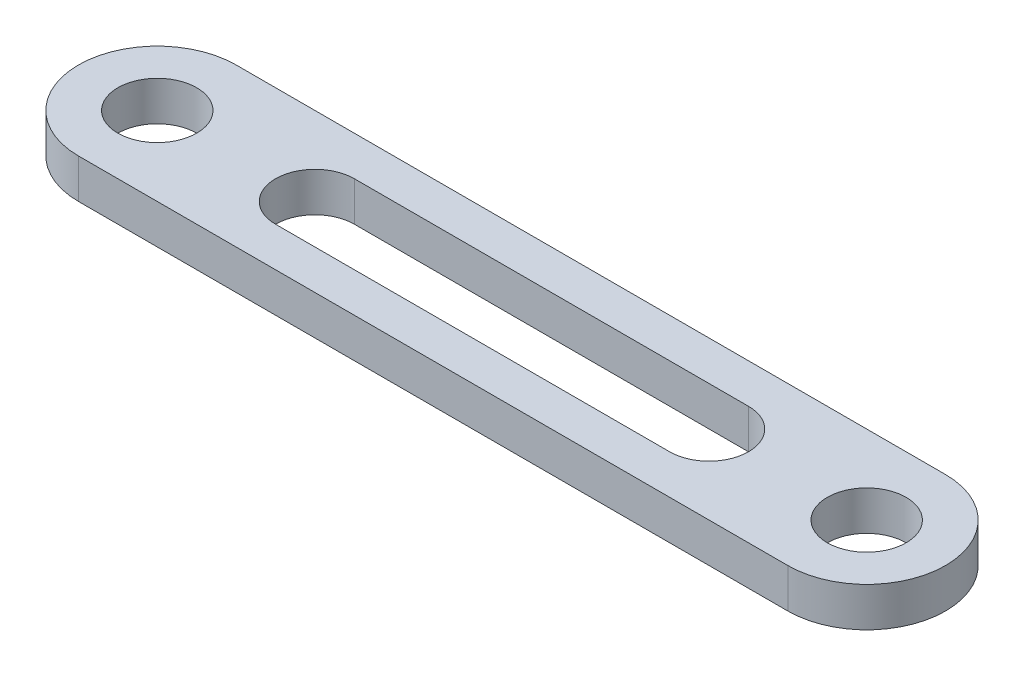
ISO-10303-21;
HEADER;
FILE_DESCRIPTION(('STEP AP214'),'2;1');
FILE_NAME('part.step','',(''),(''),'','','');
FILE_SCHEMA(('AUTOMOTIVE_DESIGN { 1 0 10303 214 1 1 1 1 }'));
ENDSEC;
DATA;
#1=APPLICATION_CONTEXT('core data for automotive mechanical design processes');
#2=APPLICATION_PROTOCOL_DEFINITION('international standard','automotive_design',2000,#1);
#3=PRODUCT_CONTEXT('',#1,'mechanical');
#4=PRODUCT('Part','Part','',(#3));
#5=PRODUCT_RELATED_PRODUCT_CATEGORY('part','',(#4));
#6=PRODUCT_DEFINITION_FORMATION('','',#4);
#7=PRODUCT_DEFINITION_CONTEXT('part definition',#1,'design');
#8=PRODUCT_DEFINITION('design','',#6,#7);
#9=PRODUCT_DEFINITION_SHAPE('','',#8);
#10=(LENGTH_UNIT() NAMED_UNIT(*) SI_UNIT(.MILLI.,.METRE.));
#11=(NAMED_UNIT(*) PLANE_ANGLE_UNIT() SI_UNIT($,.RADIAN.));
#12=(NAMED_UNIT(*) SI_UNIT($,.STERADIAN.) SOLID_ANGLE_UNIT());
#13=UNCERTAINTY_MEASURE_WITH_UNIT(LENGTH_MEASURE(1.E-05),#10,'distance_accuracy_value','');
#14=(GEOMETRIC_REPRESENTATION_CONTEXT(3) GLOBAL_UNCERTAINTY_ASSIGNED_CONTEXT((#13)) GLOBAL_UNIT_ASSIGNED_CONTEXT((#10,
#11,#12)) REPRESENTATION_CONTEXT('',''));
#15=CARTESIAN_POINT('',(0.,0.,0.));
#16=DIRECTION('',(0.,0.,1.));
#17=DIRECTION('',(1.,0.,0.));
#18=AXIS2_PLACEMENT_3D('',#15,#16,#17);
#19=CARTESIAN_POINT('',(-45.,5.,0.));
#20=DIRECTION('',(0.,-1.,0.));
#21=DIRECTION('',(0.,0.,-1.));
#22=AXIS2_PLACEMENT_3D('',#19,#20,#21);
#23=CYLINDRICAL_SURFACE('',#22,10.);
#24=CARTESIAN_POINT('',(-45.,0.,0.));
#25=DIRECTION('',(0.,1.,0.));
#26=DIRECTION('',(0.,0.,1.));
#27=AXIS2_PLACEMENT_3D('',#24,#25,#26);
#28=CIRCLE('',#27,10.);
#29=CARTESIAN_POINT('',(-45.,0.,-9.99999999999999));
#30=VERTEX_POINT('',#29);
#31=CARTESIAN_POINT('',(-45.,0.,10.));
#32=VERTEX_POINT('',#31);
#33=EDGE_CURVE('E140',#30,#32,#28,.T.);
#34=ORIENTED_EDGE('',*,*,#33,.T.);
#35=DIRECTION('',(0.,-1.,0.));
#36=VECTOR('',#35,1.);
#37=CARTESIAN_POINT('',(-45.,5.,10.));
#38=LINE('',#37,#36);
#39=CARTESIAN_POINT('',(-45.,5.,10.));
#40=VERTEX_POINT('',#39);
#41=EDGE_CURVE('E11',#40,#32,#38,.T.);
#42=ORIENTED_EDGE('',*,*,#41,.F.);
#43=CARTESIAN_POINT('',(-45.,5.,0.));
#44=DIRECTION('',(0.,1.,0.));
#45=DIRECTION('',(0.,0.,1.));
#46=AXIS2_PLACEMENT_3D('',#43,#44,#45);
#47=CIRCLE('',#46,10.);
#48=CARTESIAN_POINT('',(-45.,5.,-9.99999999999999));
#49=VERTEX_POINT('',#48);
#50=EDGE_CURVE('E144',#49,#40,#47,.T.);
#51=ORIENTED_EDGE('',*,*,#50,.F.);
#52=DIRECTION('',(0.,-1.,0.));
#53=VECTOR('',#52,1.);
#54=CARTESIAN_POINT('',(-45.,5.,-9.99999999999999));
#55=LINE('',#54,#53);
#56=EDGE_CURVE('E154',#49,#30,#55,.T.);
#57=ORIENTED_EDGE('',*,*,#56,.T.);
#58=EDGE_LOOP('',(#34,#42,#51,#57));
#59=FACE_BOUND('',#58,.T.);
#60=ADVANCED_FACE('F39',(#59),#23,.T.);
#61=CARTESIAN_POINT('',(-45.,5.,10.));
#62=DIRECTION('',(0.,0.,-1.));
#63=DIRECTION('',(-1.,0.,0.));
#64=AXIS2_PLACEMENT_3D('',#61,#62,#63);
#65=PLANE('',#64);
#66=DIRECTION('',(1.,0.,0.));
#67=VECTOR('',#66,1.);
#68=CARTESIAN_POINT('',(-45.,0.,10.));
#69=LINE('',#68,#67);
#70=CARTESIAN_POINT('',(45.,0.,10.));
#71=VERTEX_POINT('',#70);
#72=EDGE_CURVE('E157',#32,#71,#69,.T.);
#73=ORIENTED_EDGE('',*,*,#72,.T.);
#74=DIRECTION('',(0.,-1.,0.));
#75=VECTOR('',#74,1.);
#76=CARTESIAN_POINT('',(45.,5.,10.));
#77=LINE('',#76,#75);
#78=CARTESIAN_POINT('',(45.,5.,10.));
#79=VERTEX_POINT('',#78);
#80=EDGE_CURVE('E46',#79,#71,#77,.T.);
#81=ORIENTED_EDGE('',*,*,#80,.F.);
#82=DIRECTION('',(1.,0.,0.));
#83=VECTOR('',#82,1.);
#84=CARTESIAN_POINT('',(-45.,5.,10.));
#85=LINE('',#84,#83);
#86=EDGE_CURVE('E147',#40,#79,#85,.T.);
#87=ORIENTED_EDGE('',*,*,#86,.F.);
#88=ORIENTED_EDGE('',*,*,#41,.T.);
#89=EDGE_LOOP('',(#73,#81,#87,#88));
#90=FACE_BOUND('',#89,.T.);
#91=ADVANCED_FACE('F185',(#90),#65,.F.);
#92=CARTESIAN_POINT('',(45.,5.,0.));
#93=DIRECTION('',(0.,-1.,0.));
#94=DIRECTION('',(0.,0.,-1.));
#95=AXIS2_PLACEMENT_3D('',#92,#93,#94);
#96=CYLINDRICAL_SURFACE('',#95,10.);
#97=CARTESIAN_POINT('',(45.,0.,0.));
#98=DIRECTION('',(0.,1.,0.));
#99=DIRECTION('',(0.,0.,1.));
#100=AXIS2_PLACEMENT_3D('',#97,#98,#99);
#101=CIRCLE('',#100,10.);
#102=CARTESIAN_POINT('',(45.,0.,-10.));
#103=VERTEX_POINT('',#102);
#104=EDGE_CURVE('E159',#71,#103,#101,.T.);
#105=ORIENTED_EDGE('',*,*,#104,.T.);
#106=DIRECTION('',(0.,-1.,0.));
#107=VECTOR('',#106,1.);
#108=CARTESIAN_POINT('',(45.,5.,-10.));
#109=LINE('',#108,#107);
#110=CARTESIAN_POINT('',(45.,5.,-10.));
#111=VERTEX_POINT('',#110);
#112=EDGE_CURVE('E164',#111,#103,#109,.T.);
#113=ORIENTED_EDGE('',*,*,#112,.F.);
#114=CARTESIAN_POINT('',(45.,5.,0.));
#115=DIRECTION('',(0.,1.,0.));
#116=DIRECTION('',(0.,0.,1.));
#117=AXIS2_PLACEMENT_3D('',#114,#115,#116);
#118=CIRCLE('',#117,10.);
#119=EDGE_CURVE('E150',#79,#111,#118,.T.);
#120=ORIENTED_EDGE('',*,*,#119,.F.);
#121=ORIENTED_EDGE('',*,*,#80,.T.);
#122=EDGE_LOOP('',(#105,#113,#120,#121));
#123=FACE_BOUND('',#122,.T.);
#124=ADVANCED_FACE('F171',(#123),#96,.T.);
#125=CARTESIAN_POINT('',(-45.,5.,-9.99999999999999));
#126=DIRECTION('',(0.,0.,1.));
#127=DIRECTION('',(1.,0.,0.));
#128=AXIS2_PLACEMENT_3D('',#125,#126,#127);
#129=PLANE('',#128);
#130=DIRECTION('',(-1.,0.,0.));
#131=VECTOR('',#130,1.);
#132=CARTESIAN_POINT('',(-45.,0.,-9.99999999999999));
#133=LINE('',#132,#131);
#134=EDGE_CURVE('E148',#103,#30,#133,.T.);
#135=ORIENTED_EDGE('',*,*,#134,.T.);
#136=ORIENTED_EDGE('',*,*,#56,.F.);
#137=DIRECTION('',(-1.,0.,0.));
#138=VECTOR('',#137,1.);
#139=CARTESIAN_POINT('',(-45.,5.,-9.99999999999999));
#140=LINE('',#139,#138);
#141=EDGE_CURVE('E152',#111,#49,#140,.T.);
#142=ORIENTED_EDGE('',*,*,#141,.F.);
#143=ORIENTED_EDGE('',*,*,#112,.T.);
#144=EDGE_LOOP('',(#135,#136,#142,#143));
#145=FACE_BOUND('',#144,.T.);
#146=ADVANCED_FACE('F178',(#145),#129,.F.);
#147=CARTESIAN_POINT('',(-45.,5.,0.));
#148=DIRECTION('',(0.,1.,0.));
#149=DIRECTION('',(0.,0.,1.));
#150=AXIS2_PLACEMENT_3D('',#147,#148,#149);
#151=PLANE('',#150);
#152=CARTESIAN_POINT('',(-45.,5.,0.));
#153=DIRECTION('',(0.,1.,0.));
#154=DIRECTION('',(0.,0.,1.));
#155=AXIS2_PLACEMENT_3D('',#152,#153,#154);
#156=CIRCLE('',#155,5.);
#157=CARTESIAN_POINT('',(-45.,5.,5.));
#158=VERTEX_POINT('',#157);
#159=EDGE_CURVE('E227',#158,#158,#156,.T.);
#160=ORIENTED_EDGE('',*,*,#159,.F.);
#161=EDGE_LOOP('',(#160));
#162=FACE_BOUND('',#161,.T.);
#163=CARTESIAN_POINT('',(45.,5.,0.));
#164=DIRECTION('',(0.,1.,0.));
#165=DIRECTION('',(0.,0.,1.));
#166=AXIS2_PLACEMENT_3D('',#163,#164,#165);
#167=CIRCLE('',#166,5.);
#168=CARTESIAN_POINT('',(45.,5.,5.));
#169=VERTEX_POINT('',#168);
#170=EDGE_CURVE('E127',#169,#169,#167,.T.);
#171=ORIENTED_EDGE('',*,*,#170,.F.);
#172=EDGE_LOOP('',(#171));
#173=FACE_BOUND('',#172,.T.);
#174=CARTESIAN_POINT('',(-25.,5.,0.));
#175=DIRECTION('',(0.,1.,0.));
#176=DIRECTION('',(0.,0.,1.));
#177=AXIS2_PLACEMENT_3D('',#174,#175,#176);
#178=CIRCLE('',#177,5.);
#179=CARTESIAN_POINT('',(-25.,5.,-5.));
#180=VERTEX_POINT('',#179);
#181=CARTESIAN_POINT('',(-25.,5.,5.));
#182=VERTEX_POINT('',#181);
#183=EDGE_CURVE('E53',#180,#182,#178,.T.);
#184=ORIENTED_EDGE('',*,*,#183,.F.);
#185=DIRECTION('',(-1.,0.,0.));
#186=VECTOR('',#185,1.);
#187=CARTESIAN_POINT('',(-25.,5.,-5.));
#188=LINE('',#187,#186);
#189=CARTESIAN_POINT('',(25.,5.,-5.));
#190=VERTEX_POINT('',#189);
#191=EDGE_CURVE('E121',#190,#180,#188,.T.);
#192=ORIENTED_EDGE('',*,*,#191,.F.);
#193=CARTESIAN_POINT('',(25.,5.,0.));
#194=DIRECTION('',(0.,1.,0.));
#195=DIRECTION('',(0.,0.,1.));
#196=AXIS2_PLACEMENT_3D('',#193,#194,#195);
#197=CIRCLE('',#196,5.);
#198=CARTESIAN_POINT('',(25.,5.,5.));
#199=VERTEX_POINT('',#198);
#200=EDGE_CURVE('E124',#199,#190,#197,.T.);
#201=ORIENTED_EDGE('',*,*,#200,.F.);
#202=DIRECTION('',(1.,0.,0.));
#203=VECTOR('',#202,1.);
#204=CARTESIAN_POINT('',(-25.,5.,5.));
#205=LINE('',#204,#203);
#206=EDGE_CURVE('E133',#182,#199,#205,.T.);
#207=ORIENTED_EDGE('',*,*,#206,.F.);
#208=EDGE_LOOP('',(#184,#192,#201,#207));
#209=FACE_BOUND('',#208,.T.);
#210=ORIENTED_EDGE('',*,*,#50,.T.);
#211=ORIENTED_EDGE('',*,*,#86,.T.);
#212=ORIENTED_EDGE('',*,*,#119,.T.);
#213=ORIENTED_EDGE('',*,*,#141,.T.);
#214=EDGE_LOOP('',(#210,#211,#212,#213));
#215=FACE_BOUND('',#214,.T.);
#216=ADVANCED_FACE('F184',(#162,#173,#209,#215),#151,.T.);
#217=CARTESIAN_POINT('',(-45.,0.,0.));
#218=DIRECTION('',(0.,1.,0.));
#219=DIRECTION('',(0.,0.,1.));
#220=AXIS2_PLACEMENT_3D('',#217,#218,#219);
#221=PLANE('',#220);
#222=CARTESIAN_POINT('',(-45.,0.,0.));
#223=DIRECTION('',(0.,1.,0.));
#224=DIRECTION('',(0.,0.,1.));
#225=AXIS2_PLACEMENT_3D('',#222,#223,#224);
#226=CIRCLE('',#225,5.);
#227=CARTESIAN_POINT('',(-45.,0.,5.));
#228=VERTEX_POINT('',#227);
#229=EDGE_CURVE('E224',#228,#228,#226,.T.);
#230=ORIENTED_EDGE('',*,*,#229,.T.);
#231=EDGE_LOOP('',(#230));
#232=FACE_BOUND('',#231,.T.);
#233=CARTESIAN_POINT('',(45.,0.,0.));
#234=DIRECTION('',(0.,1.,0.));
#235=DIRECTION('',(0.,0.,1.));
#236=AXIS2_PLACEMENT_3D('',#233,#234,#235);
#237=CIRCLE('',#236,5.);
#238=CARTESIAN_POINT('',(45.,0.,5.));
#239=VERTEX_POINT('',#238);
#240=EDGE_CURVE('E134',#239,#239,#237,.T.);
#241=ORIENTED_EDGE('',*,*,#240,.T.);
#242=EDGE_LOOP('',(#241));
#243=FACE_BOUND('',#242,.T.);
#244=DIRECTION('',(-1.,0.,0.));
#245=VECTOR('',#244,1.);
#246=CARTESIAN_POINT('',(-25.,0.,-5.));
#247=LINE('',#246,#245);
#248=CARTESIAN_POINT('',(25.,0.,-5.));
#249=VERTEX_POINT('',#248);
#250=CARTESIAN_POINT('',(-25.,0.,-5.));
#251=VERTEX_POINT('',#250);
#252=EDGE_CURVE('E111',#249,#251,#247,.T.);
#253=ORIENTED_EDGE('',*,*,#252,.T.);
#254=CARTESIAN_POINT('',(-25.,0.,0.));
#255=DIRECTION('',(0.,1.,0.));
#256=DIRECTION('',(0.,0.,1.));
#257=AXIS2_PLACEMENT_3D('',#254,#255,#256);
#258=CIRCLE('',#257,5.);
#259=CARTESIAN_POINT('',(-25.,0.,5.));
#260=VERTEX_POINT('',#259);
#261=EDGE_CURVE('E105',#251,#260,#258,.T.);
#262=ORIENTED_EDGE('',*,*,#261,.T.);
#263=DIRECTION('',(1.,0.,0.));
#264=VECTOR('',#263,1.);
#265=CARTESIAN_POINT('',(-25.,0.,5.));
#266=LINE('',#265,#264);
#267=CARTESIAN_POINT('',(25.,0.,5.));
#268=VERTEX_POINT('',#267);
#269=EDGE_CURVE('E114',#260,#268,#266,.T.);
#270=ORIENTED_EDGE('',*,*,#269,.T.);
#271=CARTESIAN_POINT('',(25.,0.,0.));
#272=DIRECTION('',(0.,1.,0.));
#273=DIRECTION('',(0.,0.,1.));
#274=AXIS2_PLACEMENT_3D('',#271,#272,#273);
#275=CIRCLE('',#274,5.);
#276=EDGE_CURVE('E61',#268,#249,#275,.T.);
#277=ORIENTED_EDGE('',*,*,#276,.T.);
#278=EDGE_LOOP('',(#253,#262,#270,#277));
#279=FACE_BOUND('',#278,.T.);
#280=ORIENTED_EDGE('',*,*,#33,.F.);
#281=ORIENTED_EDGE('',*,*,#134,.F.);
#282=ORIENTED_EDGE('',*,*,#104,.F.);
#283=ORIENTED_EDGE('',*,*,#72,.F.);
#284=EDGE_LOOP('',(#280,#281,#282,#283));
#285=FACE_BOUND('',#284,.T.);
#286=ADVANCED_FACE('F118',(#232,#243,#279,#285),#221,.F.);
#287=CARTESIAN_POINT('',(-25.,0.,0.));
#288=DIRECTION('',(0.,1.,0.));
#289=DIRECTION('',(0.,0.,1.));
#290=AXIS2_PLACEMENT_3D('',#287,#288,#289);
#291=CYLINDRICAL_SURFACE('',#290,5.);
#292=ORIENTED_EDGE('',*,*,#183,.T.);
#293=DIRECTION('',(0.,1.,0.));
#294=VECTOR('',#293,1.);
#295=CARTESIAN_POINT('',(-25.,0.,5.));
#296=LINE('',#295,#294);
#297=EDGE_CURVE('E101',#260,#182,#296,.T.);
#298=ORIENTED_EDGE('',*,*,#297,.F.);
#299=ORIENTED_EDGE('',*,*,#261,.F.);
#300=DIRECTION('',(0.,1.,0.));
#301=VECTOR('',#300,1.);
#302=CARTESIAN_POINT('',(-25.,0.,-5.));
#303=LINE('',#302,#301);
#304=EDGE_CURVE('E138',#251,#180,#303,.T.);
#305=ORIENTED_EDGE('',*,*,#304,.T.);
#306=EDGE_LOOP('',(#292,#298,#299,#305));
#307=FACE_BOUND('',#306,.T.);
#308=ADVANCED_FACE('F103',(#307),#291,.F.);
#309=CARTESIAN_POINT('',(-25.,0.,-5.));
#310=DIRECTION('',(0.,0.,-1.));
#311=DIRECTION('',(-1.,0.,0.));
#312=AXIS2_PLACEMENT_3D('',#309,#310,#311);
#313=PLANE('',#312);
#314=ORIENTED_EDGE('',*,*,#191,.T.);
#315=ORIENTED_EDGE('',*,*,#304,.F.);
#316=ORIENTED_EDGE('',*,*,#252,.F.);
#317=DIRECTION('',(0.,1.,0.));
#318=VECTOR('',#317,1.);
#319=CARTESIAN_POINT('',(25.,0.,-5.));
#320=LINE('',#319,#318);
#321=EDGE_CURVE('E141',#249,#190,#320,.T.);
#322=ORIENTED_EDGE('',*,*,#321,.T.);
#323=EDGE_LOOP('',(#314,#315,#316,#322));
#324=FACE_BOUND('',#323,.T.);
#325=ADVANCED_FACE('F203',(#324),#313,.F.);
#326=CARTESIAN_POINT('',(25.,0.,0.));
#327=DIRECTION('',(0.,1.,0.));
#328=DIRECTION('',(0.,0.,1.));
#329=AXIS2_PLACEMENT_3D('',#326,#327,#328);
#330=CYLINDRICAL_SURFACE('',#329,5.);
#331=ORIENTED_EDGE('',*,*,#200,.T.);
#332=ORIENTED_EDGE('',*,*,#321,.F.);
#333=ORIENTED_EDGE('',*,*,#276,.F.);
#334=DIRECTION('',(0.,1.,0.));
#335=VECTOR('',#334,1.);
#336=CARTESIAN_POINT('',(25.,0.,5.));
#337=LINE('',#336,#335);
#338=EDGE_CURVE('E110',#268,#199,#337,.T.);
#339=ORIENTED_EDGE('',*,*,#338,.T.);
#340=EDGE_LOOP('',(#331,#332,#333,#339));
#341=FACE_BOUND('',#340,.T.);
#342=ADVANCED_FACE('F207',(#341),#330,.F.);
#343=CARTESIAN_POINT('',(-25.,0.,5.));
#344=DIRECTION('',(0.,0.,1.));
#345=DIRECTION('',(1.,0.,0.));
#346=AXIS2_PLACEMENT_3D('',#343,#344,#345);
#347=PLANE('',#346);
#348=ORIENTED_EDGE('',*,*,#206,.T.);
#349=ORIENTED_EDGE('',*,*,#338,.F.);
#350=ORIENTED_EDGE('',*,*,#269,.F.);
#351=ORIENTED_EDGE('',*,*,#297,.T.);
#352=EDGE_LOOP('',(#348,#349,#350,#351));
#353=FACE_BOUND('',#352,.T.);
#354=ADVANCED_FACE('F115',(#353),#347,.F.);
#355=CARTESIAN_POINT('',(45.,0.,0.));
#356=DIRECTION('',(0.,1.,0.));
#357=DIRECTION('',(0.,0.,1.));
#358=AXIS2_PLACEMENT_3D('',#355,#356,#357);
#359=CYLINDRICAL_SURFACE('',#358,5.);
#360=ORIENTED_EDGE('',*,*,#240,.F.);
#361=EDGE_LOOP('',(#360));
#362=FACE_BOUND('',#361,.T.);
#363=ORIENTED_EDGE('',*,*,#170,.T.);
#364=EDGE_LOOP('',(#363));
#365=FACE_BOUND('',#364,.T.);
#366=ADVANCED_FACE('F206',(#362,#365),#359,.F.);
#367=CARTESIAN_POINT('',(-45.,0.,0.));
#368=DIRECTION('',(0.,1.,0.));
#369=DIRECTION('',(0.,0.,1.));
#370=AXIS2_PLACEMENT_3D('',#367,#368,#369);
#371=CYLINDRICAL_SURFACE('',#370,5.);
#372=ORIENTED_EDGE('',*,*,#229,.F.);
#373=EDGE_LOOP('',(#372));
#374=FACE_BOUND('',#373,.T.);
#375=ORIENTED_EDGE('',*,*,#159,.T.);
#376=EDGE_LOOP('',(#375));
#377=FACE_BOUND('',#376,.T.);
#378=ADVANCED_FACE('F215',(#374,#377),#371,.F.);
#379=CLOSED_SHELL('',(#60,#91,#124,#146,#216,#286,#308,#325,#342,#354,#366,#378));
#380=MANIFOLD_SOLID_BREP('B2',#379);
#381=ADVANCED_BREP_SHAPE_REPRESENTATION('',(#18,#380),#14);
#382=SHAPE_DEFINITION_REPRESENTATION(#9,#381);
ENDSEC;
END-ISO-10303-21;
